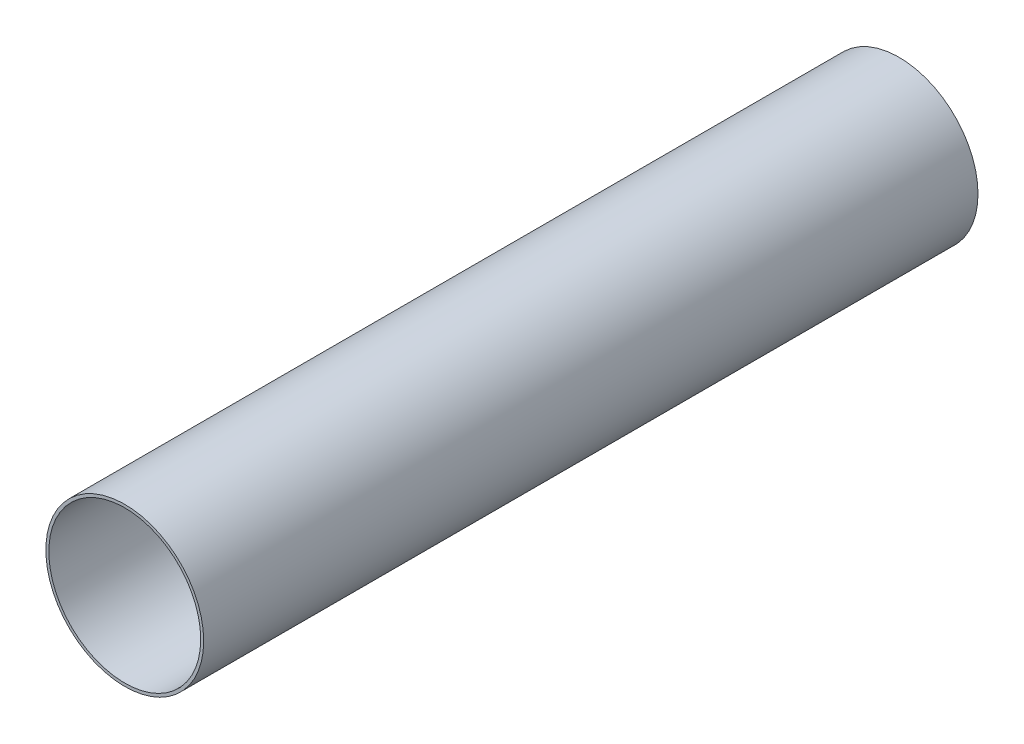
ISO-10303-21;
HEADER;
FILE_DESCRIPTION(('STEP AP214'),'2;1');
FILE_NAME('part.step','',(''),(''),'','','');
FILE_SCHEMA(('AUTOMOTIVE_DESIGN { 1 0 10303 214 1 1 1 1 }'));
ENDSEC;
DATA;
#1=APPLICATION_CONTEXT('core data for automotive mechanical design processes');
#2=APPLICATION_PROTOCOL_DEFINITION('international standard','automotive_design',2000,#1);
#3=PRODUCT_CONTEXT('',#1,'mechanical');
#4=PRODUCT('Part','Part','',(#3));
#5=PRODUCT_RELATED_PRODUCT_CATEGORY('part','',(#4));
#6=PRODUCT_DEFINITION_FORMATION('','',#4);
#7=PRODUCT_DEFINITION_CONTEXT('part definition',#1,'design');
#8=PRODUCT_DEFINITION('design','',#6,#7);
#9=PRODUCT_DEFINITION_SHAPE('','',#8);
#10=(LENGTH_UNIT() NAMED_UNIT(*) SI_UNIT(.MILLI.,.METRE.));
#11=(NAMED_UNIT(*) PLANE_ANGLE_UNIT() SI_UNIT($,.RADIAN.));
#12=(NAMED_UNIT(*) SI_UNIT($,.STERADIAN.) SOLID_ANGLE_UNIT());
#13=UNCERTAINTY_MEASURE_WITH_UNIT(LENGTH_MEASURE(1.E-05),#10,'distance_accuracy_value','');
#14=(GEOMETRIC_REPRESENTATION_CONTEXT(3) GLOBAL_UNCERTAINTY_ASSIGNED_CONTEXT((#13)) GLOBAL_UNIT_ASSIGNED_CONTEXT((#10,
#11,#12)) REPRESENTATION_CONTEXT('',''));
#15=CARTESIAN_POINT('',(0.,0.,0.));
#16=DIRECTION('',(0.,0.,1.));
#17=DIRECTION('',(1.,0.,0.));
#18=AXIS2_PLACEMENT_3D('',#15,#16,#17);
#19=CARTESIAN_POINT('',(0.,0.,130.));
#20=DIRECTION('',(0.,0.,-1.));
#21=DIRECTION('',(-1.,0.,0.));
#22=AXIS2_PLACEMENT_3D('',#19,#20,#21);
#23=CYLINDRICAL_SURFACE('',#22,13.25);
#24=CARTESIAN_POINT('',(0.,0.,130.));
#25=DIRECTION('',(0.,0.,1.));
#26=DIRECTION('',(1.,0.,0.));
#27=AXIS2_PLACEMENT_3D('',#24,#25,#26);
#28=CIRCLE('',#27,13.25);
#29=CARTESIAN_POINT('',(13.25,0.,130.));
#30=VERTEX_POINT('',#29);
#31=EDGE_CURVE('E10',#30,#30,#28,.T.);
#32=ORIENTED_EDGE('',*,*,#31,.F.);
#33=EDGE_LOOP('',(#32));
#34=FACE_BOUND('',#33,.T.);
#35=CARTESIAN_POINT('',(0.,0.,0.));
#36=DIRECTION('',(0.,0.,1.));
#37=DIRECTION('',(1.,0.,0.));
#38=AXIS2_PLACEMENT_3D('',#35,#36,#37);
#39=CIRCLE('',#38,13.25);
#40=CARTESIAN_POINT('',(13.25,0.,0.));
#41=VERTEX_POINT('',#40);
#42=EDGE_CURVE('E40',#41,#41,#39,.T.);
#43=ORIENTED_EDGE('',*,*,#42,.T.);
#44=EDGE_LOOP('',(#43));
#45=FACE_BOUND('',#44,.T.);
#46=ADVANCED_FACE('F37',(#34,#45),#23,.T.);
#47=CARTESIAN_POINT('',(0.,0.,130.));
#48=DIRECTION('',(0.,0.,1.));
#49=DIRECTION('',(1.,0.,0.));
#50=AXIS2_PLACEMENT_3D('',#47,#48,#49);
#51=PLANE('',#50);
#52=CARTESIAN_POINT('',(0.,0.,130.));
#53=DIRECTION('',(0.,0.,1.));
#54=DIRECTION('',(1.,0.,0.));
#55=AXIS2_PLACEMENT_3D('',#52,#53,#54);
#56=CIRCLE('',#55,12.75);
#57=CARTESIAN_POINT('',(12.75,0.,130.));
#58=VERTEX_POINT('',#57);
#59=EDGE_CURVE('E49',#58,#58,#56,.T.);
#60=ORIENTED_EDGE('',*,*,#59,.F.);
#61=EDGE_LOOP('',(#60));
#62=FACE_BOUND('',#61,.T.);
#63=ORIENTED_EDGE('',*,*,#31,.T.);
#64=EDGE_LOOP('',(#63));
#65=FACE_BOUND('',#64,.T.);
#66=ADVANCED_FACE('F64',(#62,#65),#51,.T.);
#67=CARTESIAN_POINT('',(0.,0.,0.));
#68=DIRECTION('',(0.,0.,1.));
#69=DIRECTION('',(1.,0.,0.));
#70=AXIS2_PLACEMENT_3D('',#67,#68,#69);
#71=PLANE('',#70);
#72=CARTESIAN_POINT('',(0.,0.,0.));
#73=DIRECTION('',(0.,0.,1.));
#74=DIRECTION('',(1.,0.,0.));
#75=AXIS2_PLACEMENT_3D('',#72,#73,#74);
#76=CIRCLE('',#75,12.75);
#77=CARTESIAN_POINT('',(12.75,0.,0.));
#78=VERTEX_POINT('',#77);
#79=EDGE_CURVE('E47',#78,#78,#76,.T.);
#80=ORIENTED_EDGE('',*,*,#79,.T.);
#81=EDGE_LOOP('',(#80));
#82=FACE_BOUND('',#81,.T.);
#83=ORIENTED_EDGE('',*,*,#42,.F.);
#84=EDGE_LOOP('',(#83));
#85=FACE_BOUND('',#84,.T.);
#86=ADVANCED_FACE('F55',(#82,#85),#71,.F.);
#87=CARTESIAN_POINT('',(0.,0.,0.));
#88=DIRECTION('',(0.,0.,1.));
#89=DIRECTION('',(1.,0.,0.));
#90=AXIS2_PLACEMENT_3D('',#87,#88,#89);
#91=CYLINDRICAL_SURFACE('',#90,12.75);
#92=ORIENTED_EDGE('',*,*,#79,.F.);
#93=EDGE_LOOP('',(#92));
#94=FACE_BOUND('',#93,.T.);
#95=ORIENTED_EDGE('',*,*,#59,.T.);
#96=EDGE_LOOP('',(#95));
#97=FACE_BOUND('',#96,.T.);
#98=ADVANCED_FACE('F58',(#94,#97),#91,.F.);
#99=CLOSED_SHELL('',(#46,#66,#86,#98));
#100=MANIFOLD_SOLID_BREP('B2',#99);
#101=ADVANCED_BREP_SHAPE_REPRESENTATION('',(#18,#100),#14);
#102=SHAPE_DEFINITION_REPRESENTATION(#9,#101);
ENDSEC;
END-ISO-10303-21;
